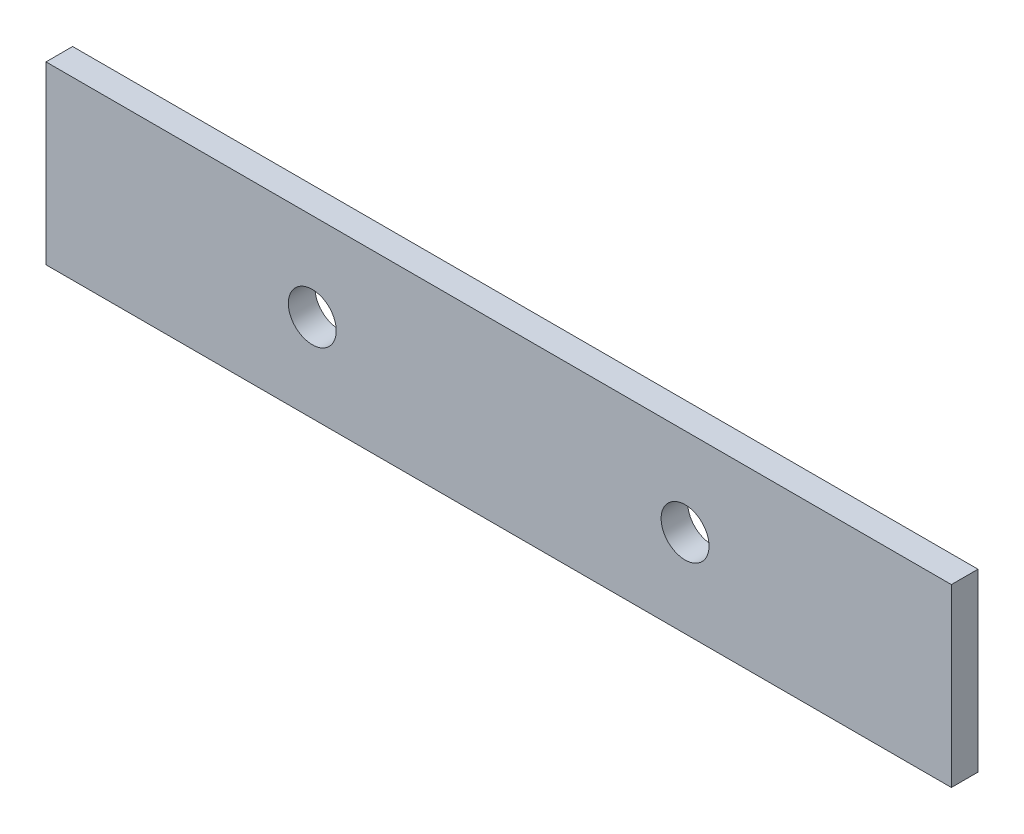
ISO-10303-21;
HEADER;
FILE_DESCRIPTION(('STEP AP214'),'2;1');
FILE_NAME('part.step','',(''),(''),'','','');
FILE_SCHEMA(('AUTOMOTIVE_DESIGN { 1 0 10303 214 1 1 1 1 }'));
ENDSEC;
DATA;
#1=APPLICATION_CONTEXT('core data for automotive mechanical design processes');
#2=APPLICATION_PROTOCOL_DEFINITION('international standard','automotive_design',2000,#1);
#3=PRODUCT_CONTEXT('',#1,'mechanical');
#4=PRODUCT('Part','Part','',(#3));
#5=PRODUCT_RELATED_PRODUCT_CATEGORY('part','',(#4));
#6=PRODUCT_DEFINITION_FORMATION('','',#4);
#7=PRODUCT_DEFINITION_CONTEXT('part definition',#1,'design');
#8=PRODUCT_DEFINITION('design','',#6,#7);
#9=PRODUCT_DEFINITION_SHAPE('','',#8);
#10=(LENGTH_UNIT() NAMED_UNIT(*) SI_UNIT(.MILLI.,.METRE.));
#11=(NAMED_UNIT(*) PLANE_ANGLE_UNIT() SI_UNIT($,.RADIAN.));
#12=(NAMED_UNIT(*) SI_UNIT($,.STERADIAN.) SOLID_ANGLE_UNIT());
#13=UNCERTAINTY_MEASURE_WITH_UNIT(LENGTH_MEASURE(1.E-05),#10,'distance_accuracy_value','');
#14=(GEOMETRIC_REPRESENTATION_CONTEXT(3) GLOBAL_UNCERTAINTY_ASSIGNED_CONTEXT((#13)) GLOBAL_UNIT_ASSIGNED_CONTEXT((#10,
#11,#12)) REPRESENTATION_CONTEXT('',''));
#15=CARTESIAN_POINT('',(0.,0.,0.));
#16=DIRECTION('',(0.,0.,1.));
#17=DIRECTION('',(1.,0.,0.));
#18=AXIS2_PLACEMENT_3D('',#15,#16,#17);
#19=CARTESIAN_POINT('',(0.,33.,0.));
#20=DIRECTION('',(1.,0.,0.));
#21=DIRECTION('',(0.,0.,-1.));
#22=AXIS2_PLACEMENT_3D('',#19,#20,#21);
#23=PLANE('',#22);
#24=DIRECTION('',(0.,0.,1.));
#25=VECTOR('',#24,1.);
#26=CARTESIAN_POINT('',(0.,0.,0.));
#27=LINE('',#26,#25);
#28=CARTESIAN_POINT('',(0.,0.,-5.));
#29=VERTEX_POINT('',#28);
#30=CARTESIAN_POINT('',(0.,0.,0.));
#31=VERTEX_POINT('',#30);
#32=EDGE_CURVE('E101',#29,#31,#27,.T.);
#33=ORIENTED_EDGE('',*,*,#32,.T.);
#34=DIRECTION('',(0.,-1.,0.));
#35=VECTOR('',#34,1.);
#36=CARTESIAN_POINT('',(0.,33.,0.));
#37=LINE('',#36,#35);
#38=CARTESIAN_POINT('',(0.,33.,0.));
#39=VERTEX_POINT('',#38);
#40=EDGE_CURVE('E11',#39,#31,#37,.T.);
#41=ORIENTED_EDGE('',*,*,#40,.F.);
#42=DIRECTION('',(0.,0.,1.));
#43=VECTOR('',#42,1.);
#44=CARTESIAN_POINT('',(0.,33.,0.));
#45=LINE('',#44,#43);
#46=CARTESIAN_POINT('',(0.,33.,-5.));
#47=VERTEX_POINT('',#46);
#48=EDGE_CURVE('E88',#47,#39,#45,.T.);
#49=ORIENTED_EDGE('',*,*,#48,.F.);
#50=DIRECTION('',(0.,-1.,0.));
#51=VECTOR('',#50,1.);
#52=CARTESIAN_POINT('',(0.,33.,-5.));
#53=LINE('',#52,#51);
#54=EDGE_CURVE('E97',#47,#29,#53,.T.);
#55=ORIENTED_EDGE('',*,*,#54,.T.);
#56=EDGE_LOOP('',(#33,#41,#49,#55));
#57=FACE_BOUND('',#56,.T.);
#58=ADVANCED_FACE('F35',(#57),#23,.F.);
#59=CARTESIAN_POINT('',(0.,33.,0.));
#60=DIRECTION('',(0.,0.,-1.));
#61=DIRECTION('',(-1.,0.,0.));
#62=AXIS2_PLACEMENT_3D('',#59,#60,#61);
#63=PLANE('',#62);
#64=CARTESIAN_POINT('',(50.,16.5,0.));
#65=DIRECTION('',(0.,0.,1.));
#66=DIRECTION('',(1.,0.,0.));
#67=AXIS2_PLACEMENT_3D('',#64,#65,#66);
#68=CIRCLE('',#67,4.5);
#69=CARTESIAN_POINT('',(54.5,16.5,0.));
#70=VERTEX_POINT('',#69);
#71=EDGE_CURVE('E110',#70,#70,#68,.T.);
#72=ORIENTED_EDGE('',*,*,#71,.F.);
#73=EDGE_LOOP('',(#72));
#74=FACE_BOUND('',#73,.T.);
#75=CARTESIAN_POINT('',(120.,16.5,0.));
#76=DIRECTION('',(0.,0.,1.));
#77=DIRECTION('',(1.,0.,0.));
#78=AXIS2_PLACEMENT_3D('',#75,#76,#77);
#79=CIRCLE('',#78,4.5);
#80=CARTESIAN_POINT('',(124.5,16.5,0.));
#81=VERTEX_POINT('',#80);
#82=EDGE_CURVE('E115',#81,#81,#79,.T.);
#83=ORIENTED_EDGE('',*,*,#82,.F.);
#84=EDGE_LOOP('',(#83));
#85=FACE_BOUND('',#84,.T.);
#86=DIRECTION('',(1.,0.,0.));
#87=VECTOR('',#86,1.);
#88=CARTESIAN_POINT('',(0.,0.,0.));
#89=LINE('',#88,#87);
#90=CARTESIAN_POINT('',(170.,0.,0.));
#91=VERTEX_POINT('',#90);
#92=EDGE_CURVE('E92',#31,#91,#89,.T.);
#93=ORIENTED_EDGE('',*,*,#92,.T.);
#94=DIRECTION('',(0.,-1.,0.));
#95=VECTOR('',#94,1.);
#96=CARTESIAN_POINT('',(170.,33.,0.));
#97=LINE('',#96,#95);
#98=CARTESIAN_POINT('',(170.,33.,0.));
#99=VERTEX_POINT('',#98);
#100=EDGE_CURVE('E44',#99,#91,#97,.T.);
#101=ORIENTED_EDGE('',*,*,#100,.F.);
#102=DIRECTION('',(1.,0.,0.));
#103=VECTOR('',#102,1.);
#104=CARTESIAN_POINT('',(0.,33.,0.));
#105=LINE('',#104,#103);
#106=EDGE_CURVE('E83',#39,#99,#105,.T.);
#107=ORIENTED_EDGE('',*,*,#106,.F.);
#108=ORIENTED_EDGE('',*,*,#40,.T.);
#109=EDGE_LOOP('',(#93,#101,#107,#108));
#110=FACE_BOUND('',#109,.T.);
#111=ADVANCED_FACE('F91',(#74,#85,#110),#63,.F.);
#112=CARTESIAN_POINT('',(170.,33.,0.));
#113=DIRECTION('',(-1.,0.,0.));
#114=DIRECTION('',(0.,0.,1.));
#115=AXIS2_PLACEMENT_3D('',#112,#113,#114);
#116=PLANE('',#115);
#117=DIRECTION('',(0.,0.,-1.));
#118=VECTOR('',#117,1.);
#119=CARTESIAN_POINT('',(170.,0.,0.));
#120=LINE('',#119,#118);
#121=CARTESIAN_POINT('',(170.,0.,-5.));
#122=VERTEX_POINT('',#121);
#123=EDGE_CURVE('E70',#91,#122,#120,.T.);
#124=ORIENTED_EDGE('',*,*,#123,.T.);
#125=DIRECTION('',(0.,-1.,0.));
#126=VECTOR('',#125,1.);
#127=CARTESIAN_POINT('',(170.,33.,-5.));
#128=LINE('',#127,#126);
#129=CARTESIAN_POINT('',(170.,33.,-5.));
#130=VERTEX_POINT('',#129);
#131=EDGE_CURVE('E93',#130,#122,#128,.T.);
#132=ORIENTED_EDGE('',*,*,#131,.F.);
#133=DIRECTION('',(0.,0.,-1.));
#134=VECTOR('',#133,1.);
#135=CARTESIAN_POINT('',(170.,33.,0.));
#136=LINE('',#135,#134);
#137=EDGE_CURVE('E86',#99,#130,#136,.T.);
#138=ORIENTED_EDGE('',*,*,#137,.F.);
#139=ORIENTED_EDGE('',*,*,#100,.T.);
#140=EDGE_LOOP('',(#124,#132,#138,#139));
#141=FACE_BOUND('',#140,.T.);
#142=ADVANCED_FACE('F95',(#141),#116,.F.);
#143=CARTESIAN_POINT('',(0.,33.,-5.));
#144=DIRECTION('',(0.,0.,1.));
#145=DIRECTION('',(1.,0.,0.));
#146=AXIS2_PLACEMENT_3D('',#143,#144,#145);
#147=PLANE('',#146);
#148=CARTESIAN_POINT('',(50.,16.5,-5.));
#149=DIRECTION('',(0.,0.,1.));
#150=DIRECTION('',(1.,0.,0.));
#151=AXIS2_PLACEMENT_3D('',#148,#149,#150);
#152=CIRCLE('',#151,4.5);
#153=CARTESIAN_POINT('',(54.5,16.5,-5.));
#154=VERTEX_POINT('',#153);
#155=EDGE_CURVE('E38',#154,#154,#152,.T.);
#156=ORIENTED_EDGE('',*,*,#155,.T.);
#157=EDGE_LOOP('',(#156));
#158=FACE_BOUND('',#157,.T.);
#159=CARTESIAN_POINT('',(120.,16.5,-5.));
#160=DIRECTION('',(0.,0.,1.));
#161=DIRECTION('',(1.,0.,0.));
#162=AXIS2_PLACEMENT_3D('',#159,#160,#161);
#163=CIRCLE('',#162,4.5);
#164=CARTESIAN_POINT('',(124.5,16.5,-5.));
#165=VERTEX_POINT('',#164);
#166=EDGE_CURVE('E108',#165,#165,#163,.T.);
#167=ORIENTED_EDGE('',*,*,#166,.T.);
#168=EDGE_LOOP('',(#167));
#169=FACE_BOUND('',#168,.T.);
#170=DIRECTION('',(-1.,0.,0.));
#171=VECTOR('',#170,1.);
#172=CARTESIAN_POINT('',(0.,0.,-5.));
#173=LINE('',#172,#171);
#174=EDGE_CURVE('E76',#122,#29,#173,.T.);
#175=ORIENTED_EDGE('',*,*,#174,.T.);
#176=ORIENTED_EDGE('',*,*,#54,.F.);
#177=DIRECTION('',(-1.,0.,0.));
#178=VECTOR('',#177,1.);
#179=CARTESIAN_POINT('',(0.,33.,-5.));
#180=LINE('',#179,#178);
#181=EDGE_CURVE('E53',#130,#47,#180,.T.);
#182=ORIENTED_EDGE('',*,*,#181,.F.);
#183=ORIENTED_EDGE('',*,*,#131,.T.);
#184=EDGE_LOOP('',(#175,#176,#182,#183));
#185=FACE_BOUND('',#184,.T.);
#186=ADVANCED_FACE('F132',(#158,#169,#185),#147,.F.);
#187=CARTESIAN_POINT('',(0.,33.,0.));
#188=DIRECTION('',(0.,-1.,0.));
#189=DIRECTION('',(0.,0.,-1.));
#190=AXIS2_PLACEMENT_3D('',#187,#188,#189);
#191=PLANE('',#190);
#192=ORIENTED_EDGE('',*,*,#48,.T.);
#193=ORIENTED_EDGE('',*,*,#106,.T.);
#194=ORIENTED_EDGE('',*,*,#137,.T.);
#195=ORIENTED_EDGE('',*,*,#181,.T.);
#196=EDGE_LOOP('',(#192,#193,#194,#195));
#197=FACE_BOUND('',#196,.T.);
#198=ADVANCED_FACE('F84',(#197),#191,.F.);
#199=CARTESIAN_POINT('',(0.,0.,0.));
#200=DIRECTION('',(0.,-1.,0.));
#201=DIRECTION('',(0.,0.,-1.));
#202=AXIS2_PLACEMENT_3D('',#199,#200,#201);
#203=PLANE('',#202);
#204=ORIENTED_EDGE('',*,*,#32,.F.);
#205=ORIENTED_EDGE('',*,*,#174,.F.);
#206=ORIENTED_EDGE('',*,*,#123,.F.);
#207=ORIENTED_EDGE('',*,*,#92,.F.);
#208=EDGE_LOOP('',(#204,#205,#206,#207));
#209=FACE_BOUND('',#208,.T.);
#210=ADVANCED_FACE('F139',(#209),#203,.T.);
#211=CARTESIAN_POINT('',(120.,16.5,-10.));
#212=DIRECTION('',(0.,0.,1.));
#213=DIRECTION('',(1.,0.,0.));
#214=AXIS2_PLACEMENT_3D('',#211,#212,#213);
#215=CYLINDRICAL_SURFACE('',#214,4.5);
#216=ORIENTED_EDGE('',*,*,#82,.T.);
#217=EDGE_LOOP('',(#216));
#218=FACE_BOUND('',#217,.T.);
#219=ORIENTED_EDGE('',*,*,#166,.F.);
#220=EDGE_LOOP('',(#219));
#221=FACE_BOUND('',#220,.T.);
#222=ADVANCED_FACE('F123',(#218,#221),#215,.F.);
#223=CARTESIAN_POINT('',(50.,16.5,-10.));
#224=DIRECTION('',(0.,0.,1.));
#225=DIRECTION('',(1.,0.,0.));
#226=AXIS2_PLACEMENT_3D('',#223,#224,#225);
#227=CYLINDRICAL_SURFACE('',#226,4.5);
#228=ORIENTED_EDGE('',*,*,#71,.T.);
#229=EDGE_LOOP('',(#228));
#230=FACE_BOUND('',#229,.T.);
#231=ORIENTED_EDGE('',*,*,#155,.F.);
#232=EDGE_LOOP('',(#231));
#233=FACE_BOUND('',#232,.T.);
#234=ADVANCED_FACE('F147',(#230,#233),#227,.F.);
#235=CLOSED_SHELL('',(#58,#111,#142,#186,#198,#210,#222,#234));
#236=MANIFOLD_SOLID_BREP('B2',#235);
#237=ADVANCED_BREP_SHAPE_REPRESENTATION('',(#18,#236),#14);
#238=SHAPE_DEFINITION_REPRESENTATION(#9,#237);
ENDSEC;
END-ISO-10303-21;
